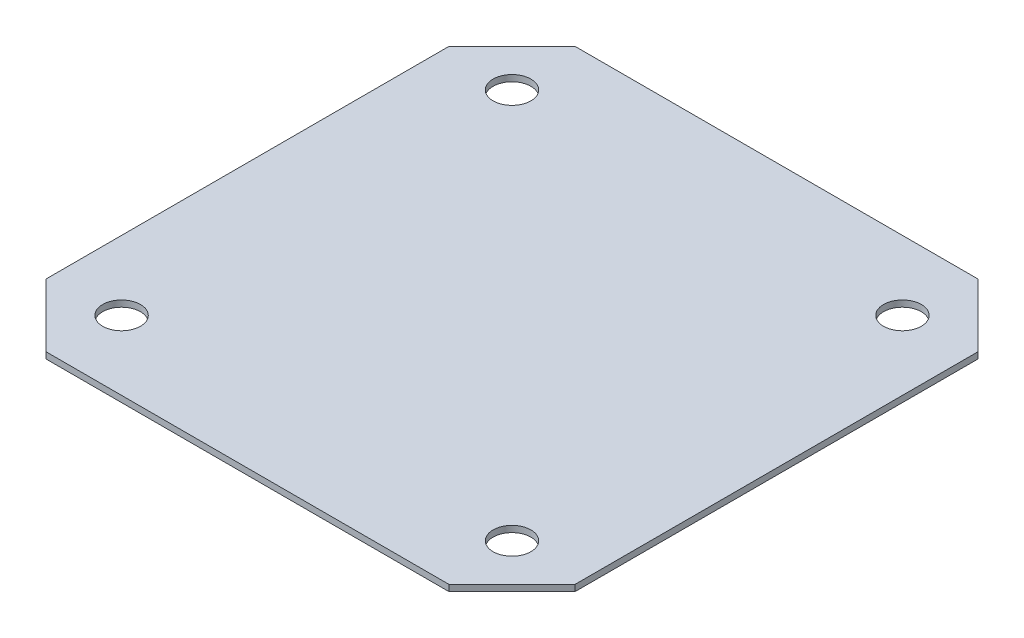
ISO-10303-21;
HEADER;
FILE_DESCRIPTION(('STEP AP214'),'2;1');
FILE_NAME('part.step','',(''),(''),'','','');
FILE_SCHEMA(('AUTOMOTIVE_DESIGN { 1 0 10303 214 1 1 1 1 }'));
ENDSEC;
DATA;
#1=APPLICATION_CONTEXT('core data for automotive mechanical design processes');
#2=APPLICATION_PROTOCOL_DEFINITION('international standard','automotive_design',2000,#1);
#3=PRODUCT_CONTEXT('',#1,'mechanical');
#4=PRODUCT('Part','Part','',(#3));
#5=PRODUCT_RELATED_PRODUCT_CATEGORY('part','',(#4));
#6=PRODUCT_DEFINITION_FORMATION('','',#4);
#7=PRODUCT_DEFINITION_CONTEXT('part definition',#1,'design');
#8=PRODUCT_DEFINITION('design','',#6,#7);
#9=PRODUCT_DEFINITION_SHAPE('','',#8);
#10=(LENGTH_UNIT() NAMED_UNIT(*) SI_UNIT(.MILLI.,.METRE.));
#11=(NAMED_UNIT(*) PLANE_ANGLE_UNIT() SI_UNIT($,.RADIAN.));
#12=(NAMED_UNIT(*) SI_UNIT($,.STERADIAN.) SOLID_ANGLE_UNIT());
#13=UNCERTAINTY_MEASURE_WITH_UNIT(LENGTH_MEASURE(1.E-05),#10,'distance_accuracy_value','');
#14=(GEOMETRIC_REPRESENTATION_CONTEXT(3) GLOBAL_UNCERTAINTY_ASSIGNED_CONTEXT((#13)) GLOBAL_UNIT_ASSIGNED_CONTEXT((#10,
#11,#12)) REPRESENTATION_CONTEXT('',''));
#15=CARTESIAN_POINT('',(0.,0.,0.));
#16=DIRECTION('',(0.,0.,1.));
#17=DIRECTION('',(1.,0.,0.));
#18=AXIS2_PLACEMENT_3D('',#15,#16,#17);
#19=CARTESIAN_POINT('',(0.,0.5,0.));
#20=DIRECTION('',(1.,0.,0.));
#21=DIRECTION('',(0.,0.,-1.));
#22=AXIS2_PLACEMENT_3D('',#19,#20,#21);
#23=PLANE('',#22);
#24=DIRECTION('',(0.,0.,1.));
#25=VECTOR('',#24,1.);
#26=CARTESIAN_POINT('',(0.,0.,0.));
#27=LINE('',#26,#25);
#28=CARTESIAN_POINT('',(0.,0.,5.));
#29=VERTEX_POINT('',#28);
#30=CARTESIAN_POINT('',(0.,0.,37.));
#31=VERTEX_POINT('',#30);
#32=EDGE_CURVE('E137',#29,#31,#27,.T.);
#33=ORIENTED_EDGE('',*,*,#32,.T.);
#34=DIRECTION('',(0.,1.,0.));
#35=VECTOR('',#34,1.);
#36=CARTESIAN_POINT('',(0.,0.5,37.));
#37=LINE('',#36,#35);
#38=CARTESIAN_POINT('',(0.,0.5,37.));
#39=VERTEX_POINT('',#38);
#40=EDGE_CURVE('E115',#31,#39,#37,.T.);
#41=ORIENTED_EDGE('',*,*,#40,.T.);
#42=DIRECTION('',(0.,0.,1.));
#43=VECTOR('',#42,1.);
#44=CARTESIAN_POINT('',(0.,0.5,0.));
#45=LINE('',#44,#43);
#46=CARTESIAN_POINT('',(0.,0.5,5.));
#47=VERTEX_POINT('',#46);
#48=EDGE_CURVE('E148',#47,#39,#45,.T.);
#49=ORIENTED_EDGE('',*,*,#48,.F.);
#50=DIRECTION('',(0.,-1.,0.));
#51=VECTOR('',#50,1.);
#52=CARTESIAN_POINT('',(0.,0.5,5.));
#53=LINE('',#52,#51);
#54=EDGE_CURVE('E120',#47,#29,#53,.T.);
#55=ORIENTED_EDGE('',*,*,#54,.T.);
#56=EDGE_LOOP('',(#33,#41,#49,#55));
#57=FACE_BOUND('',#56,.T.);
#58=ADVANCED_FACE('F41',(#57),#23,.F.);
#59=CARTESIAN_POINT('',(0.,0.5,42.));
#60=DIRECTION('',(0.,0.,-1.));
#61=DIRECTION('',(-1.,0.,0.));
#62=AXIS2_PLACEMENT_3D('',#59,#60,#61);
#63=PLANE('',#62);
#64=DIRECTION('',(1.,0.,0.));
#65=VECTOR('',#64,1.);
#66=CARTESIAN_POINT('',(0.,0.5,42.));
#67=LINE('',#66,#65);
#68=CARTESIAN_POINT('',(4.99999999999999,0.5,42.));
#69=VERTEX_POINT('',#68);
#70=CARTESIAN_POINT('',(37.,0.5,42.));
#71=VERTEX_POINT('',#70);
#72=EDGE_CURVE('E130',#69,#71,#67,.T.);
#73=ORIENTED_EDGE('',*,*,#72,.F.);
#74=DIRECTION('',(0.,-1.,0.));
#75=VECTOR('',#74,1.);
#76=CARTESIAN_POINT('',(4.99999999999999,0.5,42.));
#77=LINE('',#76,#75);
#78=CARTESIAN_POINT('',(4.99999999999999,0.,42.));
#79=VERTEX_POINT('',#78);
#80=EDGE_CURVE('E114',#69,#79,#77,.T.);
#81=ORIENTED_EDGE('',*,*,#80,.T.);
#82=DIRECTION('',(1.,0.,0.));
#83=VECTOR('',#82,1.);
#84=CARTESIAN_POINT('',(0.,0.,42.));
#85=LINE('',#84,#83);
#86=CARTESIAN_POINT('',(37.,0.,42.));
#87=VERTEX_POINT('',#86);
#88=EDGE_CURVE('E127',#79,#87,#85,.T.);
#89=ORIENTED_EDGE('',*,*,#88,.T.);
#90=DIRECTION('',(0.,1.,0.));
#91=VECTOR('',#90,1.);
#92=CARTESIAN_POINT('',(37.,0.5,42.));
#93=LINE('',#92,#91);
#94=EDGE_CURVE('E132',#87,#71,#93,.T.);
#95=ORIENTED_EDGE('',*,*,#94,.T.);
#96=EDGE_LOOP('',(#73,#81,#89,#95));
#97=FACE_BOUND('',#96,.T.);
#98=ADVANCED_FACE('F126',(#97),#63,.F.);
#99=CARTESIAN_POINT('',(42.,0.5,0.));
#100=DIRECTION('',(-1.,0.,0.));
#101=DIRECTION('',(0.,0.,1.));
#102=AXIS2_PLACEMENT_3D('',#99,#100,#101);
#103=PLANE('',#102);
#104=DIRECTION('',(0.,0.,-1.));
#105=VECTOR('',#104,1.);
#106=CARTESIAN_POINT('',(42.,0.5,0.));
#107=LINE('',#106,#105);
#108=CARTESIAN_POINT('',(42.,0.5,37.));
#109=VERTEX_POINT('',#108);
#110=CARTESIAN_POINT('',(42.,0.5,5.00000000000002));
#111=VERTEX_POINT('',#110);
#112=EDGE_CURVE('E177',#109,#111,#107,.T.);
#113=ORIENTED_EDGE('',*,*,#112,.F.);
#114=DIRECTION('',(0.,-1.,0.));
#115=VECTOR('',#114,1.);
#116=CARTESIAN_POINT('',(42.,0.5,37.));
#117=LINE('',#116,#115);
#118=CARTESIAN_POINT('',(42.,0.,37.));
#119=VERTEX_POINT('',#118);
#120=EDGE_CURVE('E170',#109,#119,#117,.T.);
#121=ORIENTED_EDGE('',*,*,#120,.T.);
#122=DIRECTION('',(0.,0.,-1.));
#123=VECTOR('',#122,1.);
#124=CARTESIAN_POINT('',(42.,0.,0.));
#125=LINE('',#124,#123);
#126=CARTESIAN_POINT('',(42.,0.,5.00000000000002));
#127=VERTEX_POINT('',#126);
#128=EDGE_CURVE('E136',#119,#127,#125,.T.);
#129=ORIENTED_EDGE('',*,*,#128,.T.);
#130=DIRECTION('',(0.,1.,0.));
#131=VECTOR('',#130,1.);
#132=CARTESIAN_POINT('',(42.,0.5,5.00000000000002));
#133=LINE('',#132,#131);
#134=EDGE_CURVE('E167',#127,#111,#133,.T.);
#135=ORIENTED_EDGE('',*,*,#134,.T.);
#136=EDGE_LOOP('',(#113,#121,#129,#135));
#137=FACE_BOUND('',#136,.T.);
#138=ADVANCED_FACE('F175',(#137),#103,.F.);
#139=CARTESIAN_POINT('',(0.,0.5,0.));
#140=DIRECTION('',(0.,0.,1.));
#141=DIRECTION('',(1.,0.,0.));
#142=AXIS2_PLACEMENT_3D('',#139,#140,#141);
#143=PLANE('',#142);
#144=DIRECTION('',(-1.,0.,0.));
#145=VECTOR('',#144,1.);
#146=CARTESIAN_POINT('',(0.,0.5,0.));
#147=LINE('',#146,#145);
#148=CARTESIAN_POINT('',(37.,0.5,0.));
#149=VERTEX_POINT('',#148);
#150=CARTESIAN_POINT('',(5.00000000000001,0.5,0.));
#151=VERTEX_POINT('',#150);
#152=EDGE_CURVE('E149',#149,#151,#147,.T.);
#153=ORIENTED_EDGE('',*,*,#152,.F.);
#154=DIRECTION('',(0.,-1.,0.));
#155=VECTOR('',#154,1.);
#156=CARTESIAN_POINT('',(37.,0.5,0.));
#157=LINE('',#156,#155);
#158=CARTESIAN_POINT('',(37.,0.,0.));
#159=VERTEX_POINT('',#158);
#160=EDGE_CURVE('E11',#149,#159,#157,.T.);
#161=ORIENTED_EDGE('',*,*,#160,.T.);
#162=DIRECTION('',(-1.,0.,0.));
#163=VECTOR('',#162,1.);
#164=CARTESIAN_POINT('',(0.,0.,0.));
#165=LINE('',#164,#163);
#166=CARTESIAN_POINT('',(5.00000000000001,0.,0.));
#167=VERTEX_POINT('',#166);
#168=EDGE_CURVE('E141',#159,#167,#165,.T.);
#169=ORIENTED_EDGE('',*,*,#168,.T.);
#170=DIRECTION('',(0.,1.,0.));
#171=VECTOR('',#170,1.);
#172=CARTESIAN_POINT('',(5.00000000000001,0.5,0.));
#173=LINE('',#172,#171);
#174=EDGE_CURVE('E50',#167,#151,#173,.T.);
#175=ORIENTED_EDGE('',*,*,#174,.T.);
#176=EDGE_LOOP('',(#153,#161,#169,#175));
#177=FACE_BOUND('',#176,.T.);
#178=ADVANCED_FACE('F184',(#177),#143,.F.);
#179=CARTESIAN_POINT('',(0.,0.5,0.));
#180=DIRECTION('',(0.,1.,0.));
#181=DIRECTION('',(0.,0.,1.));
#182=AXIS2_PLACEMENT_3D('',#179,#180,#181);
#183=PLANE('',#182);
#184=CARTESIAN_POINT('',(5.5,0.5,5.5));
#185=DIRECTION('',(0.,1.,0.));
#186=DIRECTION('',(0.,0.,1.));
#187=AXIS2_PLACEMENT_3D('',#184,#185,#186);
#188=CIRCLE('',#187,1.5);
#189=CARTESIAN_POINT('',(5.5,0.5,7.));
#190=VERTEX_POINT('',#189);
#191=EDGE_CURVE('E196',#190,#190,#188,.T.);
#192=ORIENTED_EDGE('',*,*,#191,.F.);
#193=EDGE_LOOP('',(#192));
#194=FACE_BOUND('',#193,.T.);
#195=CARTESIAN_POINT('',(36.5,0.5,36.5));
#196=DIRECTION('',(0.,1.,0.));
#197=DIRECTION('',(0.,0.,1.));
#198=AXIS2_PLACEMENT_3D('',#195,#196,#197);
#199=CIRCLE('',#198,1.5);
#200=CARTESIAN_POINT('',(36.5,0.5,38.));
#201=VERTEX_POINT('',#200);
#202=EDGE_CURVE('E202',#201,#201,#199,.T.);
#203=ORIENTED_EDGE('',*,*,#202,.F.);
#204=EDGE_LOOP('',(#203));
#205=FACE_BOUND('',#204,.T.);
#206=CARTESIAN_POINT('',(5.5,0.5,36.5));
#207=DIRECTION('',(0.,1.,0.));
#208=DIRECTION('',(0.,0.,1.));
#209=AXIS2_PLACEMENT_3D('',#206,#207,#208);
#210=CIRCLE('',#209,1.5);
#211=CARTESIAN_POINT('',(5.5,0.5,38.));
#212=VERTEX_POINT('',#211);
#213=EDGE_CURVE('E203',#212,#212,#210,.T.);
#214=ORIENTED_EDGE('',*,*,#213,.F.);
#215=EDGE_LOOP('',(#214));
#216=FACE_BOUND('',#215,.T.);
#217=CARTESIAN_POINT('',(36.5,0.5,5.5));
#218=DIRECTION('',(0.,1.,0.));
#219=DIRECTION('',(0.,0.,1.));
#220=AXIS2_PLACEMENT_3D('',#217,#218,#219);
#221=CIRCLE('',#220,1.5);
#222=CARTESIAN_POINT('',(36.5,0.5,7.));
#223=VERTEX_POINT('',#222);
#224=EDGE_CURVE('E192',#223,#223,#221,.T.);
#225=ORIENTED_EDGE('',*,*,#224,.F.);
#226=EDGE_LOOP('',(#225));
#227=FACE_BOUND('',#226,.T.);
#228=ORIENTED_EDGE('',*,*,#48,.T.);
#229=DIRECTION('',(-0.707106781186547,0.,-0.707106781186549));
#230=VECTOR('',#229,1.);
#231=CARTESIAN_POINT('',(-18.5,0.5,18.4999999999999));
#232=LINE('',#231,#230);
#233=EDGE_CURVE('E165',#39,#69,#232,.F.);
#234=ORIENTED_EDGE('',*,*,#233,.T.);
#235=ORIENTED_EDGE('',*,*,#72,.T.);
#236=DIRECTION('',(-0.70710678118655,0.,0.707106781186546));
#237=VECTOR('',#236,1.);
#238=CARTESIAN_POINT('',(39.4999999999999,0.5,39.5000000000001));
#239=LINE('',#238,#237);
#240=EDGE_CURVE('E163',#71,#109,#239,.F.);
#241=ORIENTED_EDGE('',*,*,#240,.T.);
#242=ORIENTED_EDGE('',*,*,#112,.T.);
#243=DIRECTION('',(0.707106781186546,0.,0.70710678118655));
#244=VECTOR('',#243,1.);
#245=CARTESIAN_POINT('',(18.5000000000001,0.5,-18.5));
#246=LINE('',#245,#244);
#247=EDGE_CURVE('E63',#111,#149,#246,.F.);
#248=ORIENTED_EDGE('',*,*,#247,.T.);
#249=ORIENTED_EDGE('',*,*,#152,.T.);
#250=DIRECTION('',(0.707106781186549,0.,-0.707106781186547));
#251=VECTOR('',#250,1.);
#252=CARTESIAN_POINT('',(2.5,0.5,2.50000000000001));
#253=LINE('',#252,#251);
#254=EDGE_CURVE('E159',#151,#47,#253,.F.);
#255=ORIENTED_EDGE('',*,*,#254,.T.);
#256=EDGE_LOOP('',(#228,#234,#235,#241,#242,#248,#249,#255));
#257=FACE_BOUND('',#256,.T.);
#258=ADVANCED_FACE('F219',(#194,#205,#216,#227,#257),#183,.T.);
#259=CARTESIAN_POINT('',(0.,0.,0.));
#260=DIRECTION('',(0.,1.,0.));
#261=DIRECTION('',(0.,0.,1.));
#262=AXIS2_PLACEMENT_3D('',#259,#260,#261);
#263=PLANE('',#262);
#264=CARTESIAN_POINT('',(5.5,0.,5.5));
#265=DIRECTION('',(0.,1.,0.));
#266=DIRECTION('',(0.,0.,1.));
#267=AXIS2_PLACEMENT_3D('',#264,#265,#266);
#268=CIRCLE('',#267,1.5);
#269=CARTESIAN_POINT('',(5.5,0.,7.));
#270=VERTEX_POINT('',#269);
#271=EDGE_CURVE('E206',#270,#270,#268,.T.);
#272=ORIENTED_EDGE('',*,*,#271,.T.);
#273=EDGE_LOOP('',(#272));
#274=FACE_BOUND('',#273,.T.);
#275=CARTESIAN_POINT('',(36.5,0.,36.5));
#276=DIRECTION('',(0.,1.,0.));
#277=DIRECTION('',(0.,0.,1.));
#278=AXIS2_PLACEMENT_3D('',#275,#276,#277);
#279=CIRCLE('',#278,1.5);
#280=CARTESIAN_POINT('',(36.5,0.,38.));
#281=VERTEX_POINT('',#280);
#282=EDGE_CURVE('E199',#281,#281,#279,.T.);
#283=ORIENTED_EDGE('',*,*,#282,.T.);
#284=EDGE_LOOP('',(#283));
#285=FACE_BOUND('',#284,.T.);
#286=CARTESIAN_POINT('',(5.5,0.,36.5));
#287=DIRECTION('',(0.,1.,0.));
#288=DIRECTION('',(0.,0.,1.));
#289=AXIS2_PLACEMENT_3D('',#286,#287,#288);
#290=CIRCLE('',#289,1.5);
#291=CARTESIAN_POINT('',(5.5,0.,38.));
#292=VERTEX_POINT('',#291);
#293=EDGE_CURVE('E211',#292,#292,#290,.T.);
#294=ORIENTED_EDGE('',*,*,#293,.T.);
#295=EDGE_LOOP('',(#294));
#296=FACE_BOUND('',#295,.T.);
#297=CARTESIAN_POINT('',(36.5,0.,5.5));
#298=DIRECTION('',(0.,1.,0.));
#299=DIRECTION('',(0.,0.,1.));
#300=AXIS2_PLACEMENT_3D('',#297,#298,#299);
#301=CIRCLE('',#300,1.5);
#302=CARTESIAN_POINT('',(36.5,0.,7.));
#303=VERTEX_POINT('',#302);
#304=EDGE_CURVE('E143',#303,#303,#301,.T.);
#305=ORIENTED_EDGE('',*,*,#304,.T.);
#306=EDGE_LOOP('',(#305));
#307=FACE_BOUND('',#306,.T.);
#308=ORIENTED_EDGE('',*,*,#88,.F.);
#309=DIRECTION('',(0.707106781186547,0.,0.707106781186549));
#310=VECTOR('',#309,1.);
#311=CARTESIAN_POINT('',(4.99999999999999,0.,42.));
#312=LINE('',#311,#310);
#313=EDGE_CURVE('E110',#79,#31,#312,.F.);
#314=ORIENTED_EDGE('',*,*,#313,.T.);
#315=ORIENTED_EDGE('',*,*,#32,.F.);
#316=DIRECTION('',(-0.707106781186549,0.,0.707106781186547));
#317=VECTOR('',#316,1.);
#318=CARTESIAN_POINT('',(0.,0.,5.));
#319=LINE('',#318,#317);
#320=EDGE_CURVE('E131',#29,#167,#319,.F.);
#321=ORIENTED_EDGE('',*,*,#320,.T.);
#322=ORIENTED_EDGE('',*,*,#168,.F.);
#323=DIRECTION('',(-0.707106781186546,0.,-0.70710678118655));
#324=VECTOR('',#323,1.);
#325=CARTESIAN_POINT('',(37.,0.,0.));
#326=LINE('',#325,#324);
#327=EDGE_CURVE('E152',#159,#127,#326,.F.);
#328=ORIENTED_EDGE('',*,*,#327,.T.);
#329=ORIENTED_EDGE('',*,*,#128,.F.);
#330=DIRECTION('',(0.70710678118655,0.,-0.707106781186546));
#331=VECTOR('',#330,1.);
#332=CARTESIAN_POINT('',(42.,0.,37.));
#333=LINE('',#332,#331);
#334=EDGE_CURVE('E121',#119,#87,#333,.F.);
#335=ORIENTED_EDGE('',*,*,#334,.T.);
#336=EDGE_LOOP('',(#308,#314,#315,#321,#322,#328,#329,#335));
#337=FACE_BOUND('',#336,.T.);
#338=ADVANCED_FACE('F134',(#274,#285,#296,#307,#337),#263,.F.);
#339=CARTESIAN_POINT('',(36.5,0.,5.5));
#340=DIRECTION('',(0.,1.,0.));
#341=DIRECTION('',(0.,0.,1.));
#342=AXIS2_PLACEMENT_3D('',#339,#340,#341);
#343=CYLINDRICAL_SURFACE('',#342,1.5);
#344=ORIENTED_EDGE('',*,*,#304,.F.);
#345=EDGE_LOOP('',(#344));
#346=FACE_BOUND('',#345,.T.);
#347=ORIENTED_EDGE('',*,*,#224,.T.);
#348=EDGE_LOOP('',(#347));
#349=FACE_BOUND('',#348,.T.);
#350=ADVANCED_FACE('F303',(#346,#349),#343,.F.);
#351=CARTESIAN_POINT('',(5.5,0.,36.5));
#352=DIRECTION('',(0.,1.,0.));
#353=DIRECTION('',(0.,0.,1.));
#354=AXIS2_PLACEMENT_3D('',#351,#352,#353);
#355=CYLINDRICAL_SURFACE('',#354,1.5);
#356=ORIENTED_EDGE('',*,*,#293,.F.);
#357=EDGE_LOOP('',(#356));
#358=FACE_BOUND('',#357,.T.);
#359=ORIENTED_EDGE('',*,*,#213,.T.);
#360=EDGE_LOOP('',(#359));
#361=FACE_BOUND('',#360,.T.);
#362=ADVANCED_FACE('F217',(#358,#361),#355,.F.);
#363=CARTESIAN_POINT('',(36.5,0.,36.5));
#364=DIRECTION('',(0.,1.,0.));
#365=DIRECTION('',(0.,0.,1.));
#366=AXIS2_PLACEMENT_3D('',#363,#364,#365);
#367=CYLINDRICAL_SURFACE('',#366,1.5);
#368=ORIENTED_EDGE('',*,*,#282,.F.);
#369=EDGE_LOOP('',(#368));
#370=FACE_BOUND('',#369,.T.);
#371=ORIENTED_EDGE('',*,*,#202,.T.);
#372=EDGE_LOOP('',(#371));
#373=FACE_BOUND('',#372,.T.);
#374=ADVANCED_FACE('F286',(#370,#373),#367,.F.);
#375=CARTESIAN_POINT('',(5.5,0.,5.5));
#376=DIRECTION('',(0.,1.,0.));
#377=DIRECTION('',(0.,0.,1.));
#378=AXIS2_PLACEMENT_3D('',#375,#376,#377);
#379=CYLINDRICAL_SURFACE('',#378,1.5);
#380=ORIENTED_EDGE('',*,*,#271,.F.);
#381=EDGE_LOOP('',(#380));
#382=FACE_BOUND('',#381,.T.);
#383=ORIENTED_EDGE('',*,*,#191,.T.);
#384=EDGE_LOOP('',(#383));
#385=FACE_BOUND('',#384,.T.);
#386=ADVANCED_FACE('F249',(#382,#385),#379,.F.);
#387=CARTESIAN_POINT('',(4.99999999999999,0.5,42.));
#388=DIRECTION('',(0.707106781186548,0.,-0.707106781186546));
#389=DIRECTION('',(0.,-1.,0.));
#390=AXIS2_PLACEMENT_3D('',#387,#388,#389);
#391=PLANE('',#390);
#392=ORIENTED_EDGE('',*,*,#233,.F.);
#393=ORIENTED_EDGE('',*,*,#40,.F.);
#394=ORIENTED_EDGE('',*,*,#313,.F.);
#395=ORIENTED_EDGE('',*,*,#80,.F.);
#396=EDGE_LOOP('',(#392,#393,#394,#395));
#397=FACE_BOUND('',#396,.T.);
#398=ADVANCED_FACE('F113',(#397),#391,.F.);
#399=CARTESIAN_POINT('',(42.,0.5,37.));
#400=DIRECTION('',(-0.707106781186545,0.,-0.707106781186549));
#401=DIRECTION('',(0.,-1.,0.));
#402=AXIS2_PLACEMENT_3D('',#399,#400,#401);
#403=PLANE('',#402);
#404=ORIENTED_EDGE('',*,*,#240,.F.);
#405=ORIENTED_EDGE('',*,*,#94,.F.);
#406=ORIENTED_EDGE('',*,*,#334,.F.);
#407=ORIENTED_EDGE('',*,*,#120,.F.);
#408=EDGE_LOOP('',(#404,#405,#406,#407));
#409=FACE_BOUND('',#408,.T.);
#410=ADVANCED_FACE('F233',(#409),#403,.F.);
#411=CARTESIAN_POINT('',(37.,0.5,0.));
#412=DIRECTION('',(-0.707106781186549,0.,0.707106781186545));
#413=DIRECTION('',(0.,-1.,0.));
#414=AXIS2_PLACEMENT_3D('',#411,#412,#413);
#415=PLANE('',#414);
#416=ORIENTED_EDGE('',*,*,#247,.F.);
#417=ORIENTED_EDGE('',*,*,#134,.F.);
#418=ORIENTED_EDGE('',*,*,#327,.F.);
#419=ORIENTED_EDGE('',*,*,#160,.F.);
#420=EDGE_LOOP('',(#416,#417,#418,#419));
#421=FACE_BOUND('',#420,.T.);
#422=ADVANCED_FACE('F183',(#421),#415,.F.);
#423=CARTESIAN_POINT('',(0.,0.5,5.));
#424=DIRECTION('',(0.707106781186546,0.,0.707106781186548));
#425=DIRECTION('',(0.,-1.,0.));
#426=AXIS2_PLACEMENT_3D('',#423,#424,#425);
#427=PLANE('',#426);
#428=ORIENTED_EDGE('',*,*,#254,.F.);
#429=ORIENTED_EDGE('',*,*,#174,.F.);
#430=ORIENTED_EDGE('',*,*,#320,.F.);
#431=ORIENTED_EDGE('',*,*,#54,.F.);
#432=EDGE_LOOP('',(#428,#429,#430,#431));
#433=FACE_BOUND('',#432,.T.);
#434=ADVANCED_FACE('F44',(#433),#427,.F.);
#435=CLOSED_SHELL('',(#58,#98,#138,#178,#258,#338,#350,#362,#374,#386,#398,#410,#422,#434));
#436=MANIFOLD_SOLID_BREP('B2',#435);
#437=ADVANCED_BREP_SHAPE_REPRESENTATION('',(#18,#436),#14);
#438=SHAPE_DEFINITION_REPRESENTATION(#9,#437);
ENDSEC;
END-ISO-10303-21;
